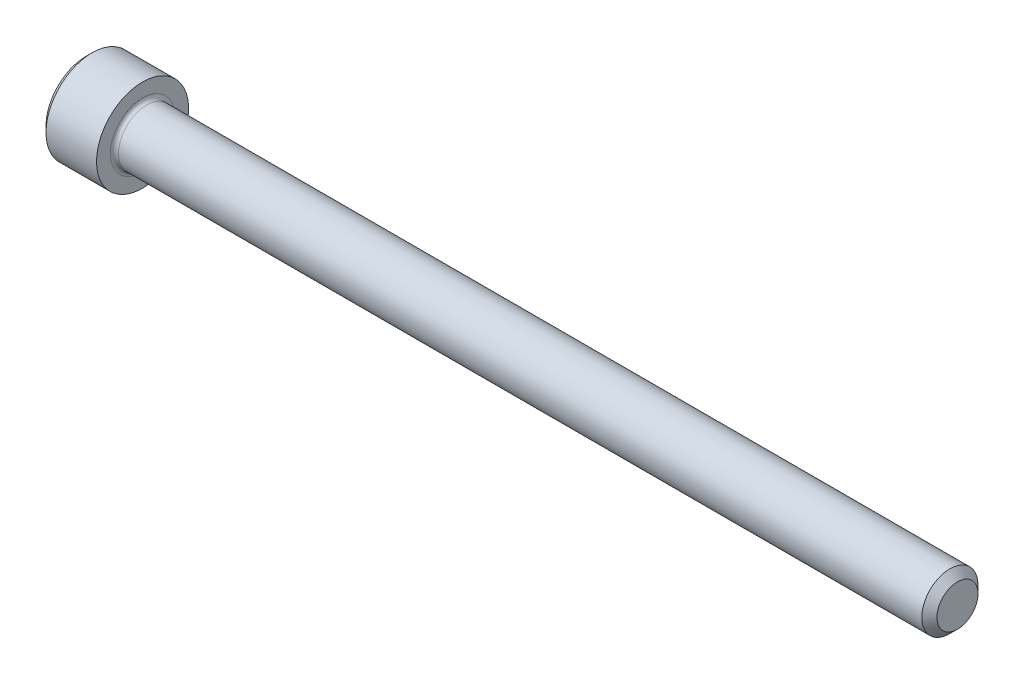
ISO-10303-21;
HEADER;
FILE_DESCRIPTION(('STEP AP214'),'2;1');
FILE_NAME('part.step','',(''),(''),'','','');
FILE_SCHEMA(('AUTOMOTIVE_DESIGN { 1 0 10303 214 1 1 1 1 }'));
ENDSEC;
DATA;
#1=APPLICATION_CONTEXT('core data for automotive mechanical design processes');
#2=APPLICATION_PROTOCOL_DEFINITION('international standard','automotive_design',2000,#1);
#3=PRODUCT_CONTEXT('',#1,'mechanical');
#4=PRODUCT('Part','Part','',(#3));
#5=PRODUCT_RELATED_PRODUCT_CATEGORY('part','',(#4));
#6=PRODUCT_DEFINITION_FORMATION('','',#4);
#7=PRODUCT_DEFINITION_CONTEXT('part definition',#1,'design');
#8=PRODUCT_DEFINITION('design','',#6,#7);
#9=PRODUCT_DEFINITION_SHAPE('','',#8);
#10=(LENGTH_UNIT() NAMED_UNIT(*) SI_UNIT(.MILLI.,.METRE.));
#11=(NAMED_UNIT(*) PLANE_ANGLE_UNIT() SI_UNIT($,.RADIAN.));
#12=(NAMED_UNIT(*) SI_UNIT($,.STERADIAN.) SOLID_ANGLE_UNIT());
#13=UNCERTAINTY_MEASURE_WITH_UNIT(LENGTH_MEASURE(1.E-05),#10,'distance_accuracy_value','');
#14=(GEOMETRIC_REPRESENTATION_CONTEXT(3) GLOBAL_UNCERTAINTY_ASSIGNED_CONTEXT((#13)) GLOBAL_UNIT_ASSIGNED_CONTEXT((#10,
#11,#12)) REPRESENTATION_CONTEXT('',''));
#15=CARTESIAN_POINT('',(0.,0.,0.));
#16=DIRECTION('',(0.,0.,1.));
#17=DIRECTION('',(1.,0.,0.));
#18=AXIS2_PLACEMENT_3D('',#15,#16,#17);
#19=CARTESIAN_POINT('',(1.62560000006806,0.,0.));
#20=DIRECTION('',(-1.,0.,0.));
#21=DIRECTION('',(0.,0.,1.));
#22=AXIS2_PLACEMENT_3D('',#19,#20,#21);
#23=CONICAL_SURFACE('',#22,1.38430000004064,1.04719755119643);
#24=CARTESIAN_POINT('',(2.42482597772664,0.,5.6843418860808E-11));
#25=VERTEX_POINT('',#24);
#26=VERTEX_LOOP('',#25);
#27=FACE_BOUND('',#26,.T.);
#28=CARTESIAN_POINT('',(1.62560000006806,0.,0.));
#29=DIRECTION('',(-1.,0.,0.));
#30=DIRECTION('',(0.,0.,1.));
#31=AXIS2_PLACEMENT_3D('',#28,#29,#30);
#32=CIRCLE('',#31,1.38430000004064);
#33=CARTESIAN_POINT('',(1.62560000003403,0.,1.38430000002032));
#34=VERTEX_POINT('',#33);
#35=CARTESIAN_POINT('',(1.62560000003403,-1.19883896647639,0.69215000001016));
#36=VERTEX_POINT('',#35);
#37=EDGE_CURVE('E99',#34,#36,#32,.F.);
#38=ORIENTED_EDGE('',*,*,#37,.F.);
#39=CARTESIAN_POINT('',(1.62560000006806,0.,0.));
#40=DIRECTION('',(-1.,0.,0.));
#41=DIRECTION('',(0.,0.,1.));
#42=AXIS2_PLACEMENT_3D('',#39,#40,#41);
#43=CIRCLE('',#42,1.38430000004064);
#44=CARTESIAN_POINT('',(1.62560000003403,1.1988389664764,0.692150000010158));
#45=VERTEX_POINT('',#44);
#46=EDGE_CURVE('E96',#45,#34,#43,.F.);
#47=ORIENTED_EDGE('',*,*,#46,.F.);
#48=CARTESIAN_POINT('',(1.62560000006806,0.,0.));
#49=DIRECTION('',(-1.,0.,0.));
#50=DIRECTION('',(0.,0.,1.));
#51=AXIS2_PLACEMENT_3D('',#48,#49,#50);
#52=CIRCLE('',#51,1.38430000004064);
#53=CARTESIAN_POINT('',(1.62560000003403,1.1988389664764,-0.692150000010162));
#54=VERTEX_POINT('',#53);
#55=EDGE_CURVE('E157',#54,#45,#52,.F.);
#56=ORIENTED_EDGE('',*,*,#55,.F.);
#57=CARTESIAN_POINT('',(1.62560000006806,0.,0.));
#58=DIRECTION('',(-1.,0.,0.));
#59=DIRECTION('',(0.,0.,1.));
#60=AXIS2_PLACEMENT_3D('',#57,#58,#59);
#61=CIRCLE('',#60,1.38430000004064);
#62=CARTESIAN_POINT('',(1.62560000003403,0.,-1.38430000002032));
#63=VERTEX_POINT('',#62);
#64=EDGE_CURVE('E154',#63,#54,#61,.F.);
#65=ORIENTED_EDGE('',*,*,#64,.F.);
#66=CARTESIAN_POINT('',(1.62560000006806,0.,0.));
#67=DIRECTION('',(-1.,0.,0.));
#68=DIRECTION('',(0.,0.,1.));
#69=AXIS2_PLACEMENT_3D('',#66,#67,#68);
#70=CIRCLE('',#69,1.38430000004064);
#71=CARTESIAN_POINT('',(1.62560000003403,-1.19883896647639,-0.692150000010157));
#72=VERTEX_POINT('',#71);
#73=EDGE_CURVE('E159',#72,#63,#70,.F.);
#74=ORIENTED_EDGE('',*,*,#73,.F.);
#75=CARTESIAN_POINT('',(1.62560000006806,0.,0.));
#76=DIRECTION('',(-1.,0.,0.));
#77=DIRECTION('',(0.,0.,1.));
#78=AXIS2_PLACEMENT_3D('',#75,#76,#77);
#79=CIRCLE('',#78,1.38430000004064);
#80=EDGE_CURVE('E102',#36,#72,#79,.F.);
#81=ORIENTED_EDGE('',*,*,#80,.F.);
#82=EDGE_LOOP('',(#38,#47,#56,#65,#74,#81));
#83=FACE_BOUND('',#82,.T.);
#84=ADVANCED_FACE('F17',(#27,#83),#23,.F.);
#85=CARTESIAN_POINT('',(1.6256,0.799225977639204,1.3843));
#86=DIRECTION('',(-1.,0.,0.));
#87=DIRECTION('',(0.,0.,1.));
#88=AXIS2_PLACEMENT_3D('',#85,#86,#87);
#89=PLANE('',#88);
#90=DIRECTION('',(0.,-1.,0.));
#91=VECTOR('',#90,1.);
#92=CARTESIAN_POINT('',(1.6256,-0.799225977639192,1.3843));
#93=LINE('',#92,#91);
#94=CARTESIAN_POINT('',(1.6256,0.799225977639205,1.3843));
#95=VERTEX_POINT('',#94);
#96=EDGE_CURVE('E114',#34,#95,#93,.F.);
#97=ORIENTED_EDGE('',*,*,#96,.T.);
#98=DIRECTION('',(0.,0.499999999999999,-0.86602540378444));
#99=VECTOR('',#98,1.);
#100=CARTESIAN_POINT('',(1.6256,1.5984519552784,0.));
#101=LINE('',#100,#99);
#102=EDGE_CURVE('E115',#45,#95,#101,.F.);
#103=ORIENTED_EDGE('',*,*,#102,.F.);
#104=ORIENTED_EDGE('',*,*,#46,.T.);
#105=EDGE_LOOP('',(#97,#103,#104));
#106=FACE_BOUND('',#105,.T.);
#107=ADVANCED_FACE('F119',(#106),#89,.T.);
#108=CARTESIAN_POINT('',(1.6256,0.799225977639204,1.3843));
#109=DIRECTION('',(-1.,0.,0.));
#110=DIRECTION('',(0.,0.,1.));
#111=AXIS2_PLACEMENT_3D('',#108,#109,#110);
#112=PLANE('',#111);
#113=DIRECTION('',(0.,0.500000000000001,0.866025403784438));
#114=VECTOR('',#113,1.);
#115=CARTESIAN_POINT('',(1.6256,-0.799225977639192,1.3843));
#116=LINE('',#115,#114);
#117=CARTESIAN_POINT('',(1.6256,-0.799225977639192,1.3843));
#118=VERTEX_POINT('',#117);
#119=EDGE_CURVE('E110',#118,#36,#116,.F.);
#120=ORIENTED_EDGE('',*,*,#119,.F.);
#121=DIRECTION('',(0.,-1.,0.));
#122=VECTOR('',#121,1.);
#123=CARTESIAN_POINT('',(1.6256,-0.799225977639192,1.3843));
#124=LINE('',#123,#122);
#125=EDGE_CURVE('E107',#118,#34,#124,.F.);
#126=ORIENTED_EDGE('',*,*,#125,.T.);
#127=ORIENTED_EDGE('',*,*,#37,.T.);
#128=EDGE_LOOP('',(#120,#126,#127));
#129=FACE_BOUND('',#128,.T.);
#130=ADVANCED_FACE('F108',(#129),#112,.T.);
#131=CARTESIAN_POINT('',(1.6256,0.799225977639204,1.3843));
#132=DIRECTION('',(-1.,0.,0.));
#133=DIRECTION('',(0.,0.,1.));
#134=AXIS2_PLACEMENT_3D('',#131,#132,#133);
#135=PLANE('',#134);
#136=DIRECTION('',(0.,-0.499999999999999,0.866025403784439));
#137=VECTOR('',#136,1.);
#138=CARTESIAN_POINT('',(1.6256,-1.59845195527839,0.));
#139=LINE('',#138,#137);
#140=CARTESIAN_POINT('',(1.6256,-1.59845195527839,0.));
#141=VERTEX_POINT('',#140);
#142=EDGE_CURVE('E416',#141,#72,#139,.F.);
#143=ORIENTED_EDGE('',*,*,#142,.F.);
#144=DIRECTION('',(0.,0.500000000000001,0.866025403784438));
#145=VECTOR('',#144,1.);
#146=CARTESIAN_POINT('',(1.6256,-0.799225977639192,1.3843));
#147=LINE('',#146,#145);
#148=EDGE_CURVE('E418',#36,#141,#147,.F.);
#149=ORIENTED_EDGE('',*,*,#148,.F.);
#150=ORIENTED_EDGE('',*,*,#80,.T.);
#151=EDGE_LOOP('',(#143,#149,#150));
#152=FACE_BOUND('',#151,.T.);
#153=ADVANCED_FACE('F278',(#152),#135,.T.);
#154=CARTESIAN_POINT('',(1.6256,0.799225977639204,1.3843));
#155=DIRECTION('',(-1.,0.,0.));
#156=DIRECTION('',(0.,0.,1.));
#157=AXIS2_PLACEMENT_3D('',#154,#155,#156);
#158=PLANE('',#157);
#159=DIRECTION('',(0.,1.,0.));
#160=VECTOR('',#159,1.);
#161=CARTESIAN_POINT('',(1.6256,0.799225977639201,-1.3843));
#162=LINE('',#161,#160);
#163=CARTESIAN_POINT('',(1.6256,-0.799225977639196,-1.3843));
#164=VERTEX_POINT('',#163);
#165=EDGE_CURVE('E472',#63,#164,#162,.F.);
#166=ORIENTED_EDGE('',*,*,#165,.T.);
#167=DIRECTION('',(0.,-0.499999999999999,0.866025403784439));
#168=VECTOR('',#167,1.);
#169=CARTESIAN_POINT('',(1.6256,-1.59845195527839,0.));
#170=LINE('',#169,#168);
#171=EDGE_CURVE('E421',#72,#164,#170,.F.);
#172=ORIENTED_EDGE('',*,*,#171,.F.);
#173=ORIENTED_EDGE('',*,*,#73,.T.);
#174=EDGE_LOOP('',(#166,#172,#173));
#175=FACE_BOUND('',#174,.T.);
#176=ADVANCED_FACE('F274',(#175),#158,.T.);
#177=CARTESIAN_POINT('',(1.6256,0.799225977639204,1.3843));
#178=DIRECTION('',(-1.,0.,0.));
#179=DIRECTION('',(0.,0.,1.));
#180=AXIS2_PLACEMENT_3D('',#177,#178,#179);
#181=PLANE('',#180);
#182=DIRECTION('',(0.,0.499999999999999,-0.86602540378444));
#183=VECTOR('',#182,1.);
#184=CARTESIAN_POINT('',(1.6256,1.5984519552784,0.));
#185=LINE('',#184,#183);
#186=CARTESIAN_POINT('',(1.6256,1.5984519552784,0.));
#187=VERTEX_POINT('',#186);
#188=EDGE_CURVE('E137',#187,#45,#185,.F.);
#189=ORIENTED_EDGE('',*,*,#188,.F.);
#190=DIRECTION('',(0.,0.500000000000001,0.866025403784438));
#191=VECTOR('',#190,1.);
#192=CARTESIAN_POINT('',(1.6256,1.5984519552784,0.));
#193=LINE('',#192,#191);
#194=EDGE_CURVE('E487',#187,#54,#193,.F.);
#195=ORIENTED_EDGE('',*,*,#194,.T.);
#196=ORIENTED_EDGE('',*,*,#55,.T.);
#197=EDGE_LOOP('',(#189,#195,#196));
#198=FACE_BOUND('',#197,.T.);
#199=ADVANCED_FACE('F270',(#198),#181,.T.);
#200=CARTESIAN_POINT('',(1.6256,0.799225977639204,1.3843));
#201=DIRECTION('',(-1.,0.,0.));
#202=DIRECTION('',(0.,0.,1.));
#203=AXIS2_PLACEMENT_3D('',#200,#201,#202);
#204=PLANE('',#203);
#205=DIRECTION('',(0.,0.500000000000001,0.866025403784438));
#206=VECTOR('',#205,1.);
#207=CARTESIAN_POINT('',(1.6256,1.5984519552784,0.));
#208=LINE('',#207,#206);
#209=CARTESIAN_POINT('',(1.6256,0.799225977639201,-1.3843));
#210=VERTEX_POINT('',#209);
#211=EDGE_CURVE('E461',#54,#210,#208,.F.);
#212=ORIENTED_EDGE('',*,*,#211,.T.);
#213=DIRECTION('',(0.,1.,0.));
#214=VECTOR('',#213,1.);
#215=CARTESIAN_POINT('',(1.6256,0.799225977639201,-1.3843));
#216=LINE('',#215,#214);
#217=EDGE_CURVE('E475',#210,#63,#216,.F.);
#218=ORIENTED_EDGE('',*,*,#217,.T.);
#219=ORIENTED_EDGE('',*,*,#64,.T.);
#220=EDGE_LOOP('',(#212,#218,#219));
#221=FACE_BOUND('',#220,.T.);
#222=ADVANCED_FACE('F266',(#221),#204,.T.);
#223=CARTESIAN_POINT('',(1.6256,1.5984519552784,0.));
#224=DIRECTION('',(0.,-0.86602540378444,-0.499999999999999));
#225=DIRECTION('',(0.,0.499999999999999,-0.86602540378444));
#226=AXIS2_PLACEMENT_3D('',#223,#224,#225);
#227=PLANE('',#226);
#228=ORIENTED_EDGE('',*,*,#102,.T.);
#229=DIRECTION('',(1.,0.,0.));
#230=VECTOR('',#229,1.);
#231=CARTESIAN_POINT('',(1.6256,0.799225977639205,1.3843));
#232=LINE('',#231,#230);
#233=CARTESIAN_POINT('',(0.,0.799225977639205,1.3843));
#234=VERTEX_POINT('',#233);
#235=EDGE_CURVE('E126',#95,#234,#232,.F.);
#236=ORIENTED_EDGE('',*,*,#235,.T.);
#237=DIRECTION('',(0.,-0.499999999999999,0.866025403784439));
#238=VECTOR('',#237,1.);
#239=CARTESIAN_POINT('',(0.,1.5984519552784,0.));
#240=LINE('',#239,#238);
#241=CARTESIAN_POINT('',(0.,1.5984519552784,0.));
#242=VERTEX_POINT('',#241);
#243=EDGE_CURVE('E455',#242,#234,#240,.T.);
#244=ORIENTED_EDGE('',*,*,#243,.F.);
#245=DIRECTION('',(1.,0.,0.));
#246=VECTOR('',#245,1.);
#247=CARTESIAN_POINT('',(1.6256,1.5984519552784,0.));
#248=LINE('',#247,#246);
#249=EDGE_CURVE('E482',#242,#187,#248,.T.);
#250=ORIENTED_EDGE('',*,*,#249,.T.);
#251=ORIENTED_EDGE('',*,*,#188,.T.);
#252=EDGE_LOOP('',(#228,#236,#244,#250,#251));
#253=FACE_BOUND('',#252,.T.);
#254=ADVANCED_FACE('F263',(#253),#227,.T.);
#255=CARTESIAN_POINT('',(1.6256,-0.799225977639192,1.3843));
#256=DIRECTION('',(0.,0.,1.));
#257=DIRECTION('',(0.,-1.,0.));
#258=AXIS2_PLACEMENT_3D('',#255,#256,#257);
#259=PLANE('',#258);
#260=ORIENTED_EDGE('',*,*,#235,.F.);
#261=ORIENTED_EDGE('',*,*,#96,.F.);
#262=ORIENTED_EDGE('',*,*,#125,.F.);
#263=DIRECTION('',(1.,0.,0.));
#264=VECTOR('',#263,1.);
#265=CARTESIAN_POINT('',(1.6256,-0.799225977639192,1.3843));
#266=LINE('',#265,#264);
#267=CARTESIAN_POINT('',(0.,-0.799225977639192,1.3843));
#268=VERTEX_POINT('',#267);
#269=EDGE_CURVE('E128',#268,#118,#266,.T.);
#270=ORIENTED_EDGE('',*,*,#269,.F.);
#271=DIRECTION('',(0.,1.,0.));
#272=VECTOR('',#271,1.);
#273=CARTESIAN_POINT('',(0.,0.,1.3843));
#274=LINE('',#273,#272);
#275=EDGE_CURVE('E444',#234,#268,#274,.F.);
#276=ORIENTED_EDGE('',*,*,#275,.F.);
#277=EDGE_LOOP('',(#260,#261,#262,#270,#276));
#278=FACE_BOUND('',#277,.T.);
#279=ADVANCED_FACE('F124',(#278),#259,.F.);
#280=CARTESIAN_POINT('',(1.6256,-0.799225977639192,1.3843));
#281=DIRECTION('',(0.,0.866025403784438,-0.500000000000001));
#282=DIRECTION('',(0.,0.500000000000001,0.866025403784438));
#283=AXIS2_PLACEMENT_3D('',#280,#281,#282);
#284=PLANE('',#283);
#285=ORIENTED_EDGE('',*,*,#148,.T.);
#286=DIRECTION('',(1.,0.,0.));
#287=VECTOR('',#286,1.);
#288=CARTESIAN_POINT('',(1.6256,-1.59845195527839,0.));
#289=LINE('',#288,#287);
#290=CARTESIAN_POINT('',(0.,-1.59845195527839,0.));
#291=VERTEX_POINT('',#290);
#292=EDGE_CURVE('E422',#291,#141,#289,.T.);
#293=ORIENTED_EDGE('',*,*,#292,.F.);
#294=DIRECTION('',(0.,-0.500000000000001,-0.866025403784438));
#295=VECTOR('',#294,1.);
#296=CARTESIAN_POINT('',(0.,-0.799225977639192,1.3843));
#297=LINE('',#296,#295);
#298=EDGE_CURVE('E440',#268,#291,#297,.T.);
#299=ORIENTED_EDGE('',*,*,#298,.F.);
#300=ORIENTED_EDGE('',*,*,#269,.T.);
#301=ORIENTED_EDGE('',*,*,#119,.T.);
#302=EDGE_LOOP('',(#285,#293,#299,#300,#301));
#303=FACE_BOUND('',#302,.T.);
#304=ADVANCED_FACE('F256',(#303),#284,.T.);
#305=CARTESIAN_POINT('',(1.6256,-1.59845195527839,0.));
#306=DIRECTION('',(0.,0.866025403784439,0.499999999999999));
#307=DIRECTION('',(0.,-0.499999999999999,0.866025403784439));
#308=AXIS2_PLACEMENT_3D('',#305,#306,#307);
#309=PLANE('',#308);
#310=ORIENTED_EDGE('',*,*,#171,.T.);
#311=DIRECTION('',(1.,0.,0.));
#312=VECTOR('',#311,1.);
#313=CARTESIAN_POINT('',(1.6256,-0.799225977639196,-1.3843));
#314=LINE('',#313,#312);
#315=CARTESIAN_POINT('',(0.,-0.799225977639196,-1.3843));
#316=VERTEX_POINT('',#315);
#317=EDGE_CURVE('E474',#164,#316,#314,.F.);
#318=ORIENTED_EDGE('',*,*,#317,.T.);
#319=DIRECTION('',(0.,0.499999999999999,-0.866025403784439));
#320=VECTOR('',#319,1.);
#321=CARTESIAN_POINT('',(0.,-1.59845195527839,0.));
#322=LINE('',#321,#320);
#323=EDGE_CURVE('E426',#291,#316,#322,.T.);
#324=ORIENTED_EDGE('',*,*,#323,.F.);
#325=ORIENTED_EDGE('',*,*,#292,.T.);
#326=ORIENTED_EDGE('',*,*,#142,.T.);
#327=EDGE_LOOP('',(#310,#318,#324,#325,#326));
#328=FACE_BOUND('',#327,.T.);
#329=ADVANCED_FACE('F252',(#328),#309,.T.);
#330=CARTESIAN_POINT('',(1.6256,0.799225977639201,-1.3843));
#331=DIRECTION('',(0.,0.,-1.));
#332=DIRECTION('',(0.,1.,0.));
#333=AXIS2_PLACEMENT_3D('',#330,#331,#332);
#334=PLANE('',#333);
#335=ORIENTED_EDGE('',*,*,#317,.F.);
#336=ORIENTED_EDGE('',*,*,#165,.F.);
#337=ORIENTED_EDGE('',*,*,#217,.F.);
#338=DIRECTION('',(1.,0.,0.));
#339=VECTOR('',#338,1.);
#340=CARTESIAN_POINT('',(1.6256,0.799225977639201,-1.3843));
#341=LINE('',#340,#339);
#342=CARTESIAN_POINT('',(0.,0.799225977639201,-1.3843));
#343=VERTEX_POINT('',#342);
#344=EDGE_CURVE('E458',#210,#343,#341,.F.);
#345=ORIENTED_EDGE('',*,*,#344,.T.);
#346=DIRECTION('',(0.,1.,0.));
#347=VECTOR('',#346,1.);
#348=CARTESIAN_POINT('',(0.,0.,-1.3843));
#349=LINE('',#348,#347);
#350=EDGE_CURVE('E439',#316,#343,#349,.T.);
#351=ORIENTED_EDGE('',*,*,#350,.F.);
#352=EDGE_LOOP('',(#335,#336,#337,#345,#351));
#353=FACE_BOUND('',#352,.T.);
#354=ADVANCED_FACE('F248',(#353),#334,.F.);
#355=CARTESIAN_POINT('',(1.6256,1.5984519552784,0.));
#356=DIRECTION('',(0.,0.866025403784438,-0.500000000000001));
#357=DIRECTION('',(0.,0.500000000000001,0.866025403784438));
#358=AXIS2_PLACEMENT_3D('',#355,#356,#357);
#359=PLANE('',#358);
#360=ORIENTED_EDGE('',*,*,#344,.F.);
#361=ORIENTED_EDGE('',*,*,#211,.F.);
#362=ORIENTED_EDGE('',*,*,#194,.F.);
#363=ORIENTED_EDGE('',*,*,#249,.F.);
#364=DIRECTION('',(0.,0.500000000000001,0.866025403784438));
#365=VECTOR('',#364,1.);
#366=CARTESIAN_POINT('',(0.,0.799225977639201,-1.3843));
#367=LINE('',#366,#365);
#368=EDGE_CURVE('E153',#343,#242,#367,.T.);
#369=ORIENTED_EDGE('',*,*,#368,.F.);
#370=EDGE_LOOP('',(#360,#361,#362,#363,#369));
#371=FACE_BOUND('',#370,.T.);
#372=ADVANCED_FACE('F244',(#371),#359,.F.);
#373=CARTESIAN_POINT('',(0.,0.,0.));
#374=DIRECTION('',(-1.,0.,0.));
#375=DIRECTION('',(0.,0.,1.));
#376=AXIS2_PLACEMENT_3D('',#373,#374,#375);
#377=PLANE('',#376);
#378=CARTESIAN_POINT('',(0.,0.,0.));
#379=DIRECTION('',(1.,0.,0.));
#380=DIRECTION('',(0.,0.,-1.));
#381=AXIS2_PLACEMENT_3D('',#378,#379,#380);
#382=CIRCLE('',#381,2.5145999999836);
#383=CARTESIAN_POINT('',(0.,0.,-2.5145999999836));
#384=VERTEX_POINT('',#383);
#385=EDGE_CURVE('E150',#384,#384,#382,.T.);
#386=ORIENTED_EDGE('',*,*,#385,.F.);
#387=EDGE_LOOP('',(#386));
#388=FACE_BOUND('',#387,.T.);
#389=ORIENTED_EDGE('',*,*,#350,.T.);
#390=ORIENTED_EDGE('',*,*,#368,.T.);
#391=ORIENTED_EDGE('',*,*,#243,.T.);
#392=ORIENTED_EDGE('',*,*,#275,.T.);
#393=ORIENTED_EDGE('',*,*,#298,.T.);
#394=ORIENTED_EDGE('',*,*,#323,.T.);
#395=EDGE_LOOP('',(#389,#390,#391,#392,#393,#394));
#396=FACE_BOUND('',#395,.T.);
#397=ADVANCED_FACE('F236',(#388,#396),#377,.T.);
#398=CARTESIAN_POINT('',(0.355599999863898,0.,0.));
#399=DIRECTION('',(1.,0.,0.));
#400=DIRECTION('',(0.,0.,-1.));
#401=AXIS2_PLACEMENT_3D('',#398,#399,#400);
#402=CONICAL_SURFACE('',#401,2.87019999990434,0.785398163477374);
#403=ORIENTED_EDGE('',*,*,#385,.T.);
#404=EDGE_LOOP('',(#403));
#405=FACE_BOUND('',#404,.T.);
#406=CARTESIAN_POINT('',(0.355599999999998,0.,0.));
#407=DIRECTION('',(-1.,0.,0.));
#408=DIRECTION('',(0.,0.,1.));
#409=AXIS2_PLACEMENT_3D('',#406,#407,#408);
#410=CIRCLE('',#409,2.8702);
#411=CARTESIAN_POINT('',(0.355599999999998,0.,2.8702));
#412=VERTEX_POINT('',#411);
#413=EDGE_CURVE('E149',#412,#412,#410,.F.);
#414=ORIENTED_EDGE('',*,*,#413,.F.);
#415=EDGE_LOOP('',(#414));
#416=FACE_BOUND('',#415,.T.);
#417=ADVANCED_FACE('F231',(#405,#416),#402,.T.);
#418=CARTESIAN_POINT('',(-31.75,0.,0.));
#419=DIRECTION('',(-1.,0.,0.));
#420=DIRECTION('',(0.,0.,1.));
#421=AXIS2_PLACEMENT_3D('',#418,#419,#420);
#422=CYLINDRICAL_SURFACE('',#421,2.8702);
#423=CARTESIAN_POINT('',(3.5052,0.,0.));
#424=DIRECTION('',(-1.,0.,0.));
#425=DIRECTION('',(0.,0.,1.));
#426=AXIS2_PLACEMENT_3D('',#423,#424,#425);
#427=CIRCLE('',#426,2.8702);
#428=CARTESIAN_POINT('',(3.5052,0.,2.8702));
#429=VERTEX_POINT('',#428);
#430=EDGE_CURVE('E146',#429,#429,#427,.F.);
#431=ORIENTED_EDGE('',*,*,#430,.F.);
#432=EDGE_LOOP('',(#431));
#433=FACE_BOUND('',#432,.T.);
#434=ORIENTED_EDGE('',*,*,#413,.T.);
#435=EDGE_LOOP('',(#434));
#436=FACE_BOUND('',#435,.T.);
#437=ADVANCED_FACE('F227',(#433,#436),#422,.T.);
#438=CARTESIAN_POINT('',(54.3052,1.28016,0.));
#439=DIRECTION('',(1.,0.,0.));
#440=DIRECTION('',(0.,0.,-1.));
#441=AXIS2_PLACEMENT_3D('',#438,#439,#440);
#442=PLANE('',#441);
#443=CARTESIAN_POINT('',(54.3052000000444,0.,0.));
#444=DIRECTION('',(-1.,0.,0.));
#445=DIRECTION('',(0.,0.,1.));
#446=AXIS2_PLACEMENT_3D('',#443,#444,#445);
#447=CIRCLE('',#446,1.28016000002162);
#448=CARTESIAN_POINT('',(54.3052000000444,0.,1.28016000002162));
#449=VERTEX_POINT('',#448);
#450=EDGE_CURVE('E142',#449,#449,#447,.T.);
#451=ORIENTED_EDGE('',*,*,#450,.F.);
#452=EDGE_LOOP('',(#451));
#453=FACE_BOUND('',#452,.T.);
#454=ADVANCED_FACE('F185',(#453),#442,.T.);
#455=CARTESIAN_POINT('',(3.5052,2.8702,0.));
#456=DIRECTION('',(1.,0.,0.));
#457=DIRECTION('',(0.,0.,-1.));
#458=AXIS2_PLACEMENT_3D('',#455,#456,#457);
#459=PLANE('',#458);
#460=ORIENTED_EDGE('',*,*,#430,.T.);
#461=EDGE_LOOP('',(#460));
#462=FACE_BOUND('',#461,.T.);
#463=CARTESIAN_POINT('',(3.5052,0.,0.));
#464=DIRECTION('',(1.,0.,0.));
#465=DIRECTION('',(0.,0.,1.));
#466=AXIS2_PLACEMENT_3D('',#463,#464,#465);
#467=CIRCLE('',#466,2.00659999999994);
#468=CARTESIAN_POINT('',(3.5052,0.,-2.00659999999994));
#469=VERTEX_POINT('',#468);
#470=CARTESIAN_POINT('',(3.5052,0.,2.00659999999994));
#471=VERTEX_POINT('',#470);
#472=EDGE_CURVE('E145',#469,#471,#467,.F.);
#473=ORIENTED_EDGE('',*,*,#472,.T.);
#474=CARTESIAN_POINT('',(3.5052,0.,0.));
#475=DIRECTION('',(1.,0.,0.));
#476=DIRECTION('',(0.,0.,-1.));
#477=AXIS2_PLACEMENT_3D('',#474,#475,#476);
#478=CIRCLE('',#477,2.00659999999994);
#479=EDGE_CURVE('E36',#471,#469,#478,.F.);
#480=ORIENTED_EDGE('',*,*,#479,.T.);
#481=EDGE_LOOP('',(#473,#480));
#482=FACE_BOUND('',#481,.T.);
#483=ADVANCED_FACE('F166',(#462,#482),#459,.T.);
#484=CARTESIAN_POINT('',(53.832760000148,0.,0.));
#485=DIRECTION('',(-1.,0.,0.));
#486=DIRECTION('',(0.,0.,1.));
#487=AXIS2_PLACEMENT_3D('',#484,#485,#486);
#488=CONICAL_SURFACE('',#487,1.75259999991795,0.785398163397448);
#489=CARTESIAN_POINT('',(53.8327599999999,0.,0.));
#490=DIRECTION('',(-1.,0.,0.));
#491=DIRECTION('',(0.,0.,1.));
#492=AXIS2_PLACEMENT_3D('',#489,#490,#491);
#493=CIRCLE('',#492,1.75259999999994);
#494=CARTESIAN_POINT('',(53.8327599999999,0.,1.75259999999994));
#495=VERTEX_POINT('',#494);
#496=EDGE_CURVE('E28',#495,#495,#493,.T.);
#497=ORIENTED_EDGE('',*,*,#496,.F.);
#498=EDGE_LOOP('',(#497));
#499=FACE_BOUND('',#498,.T.);
#500=ORIENTED_EDGE('',*,*,#450,.T.);
#501=EDGE_LOOP('',(#500));
#502=FACE_BOUND('',#501,.T.);
#503=ADVANCED_FACE('F184',(#499,#502),#488,.T.);
#504=CARTESIAN_POINT('',(3.7592,0.,0.));
#505=DIRECTION('',(1.,0.,0.));
#506=DIRECTION('',(0.,0.,-1.));
#507=AXIS2_PLACEMENT_3D('',#504,#505,#506);
#508=TOROIDAL_SURFACE('',#507,2.00659999999994,0.254);
#509=CARTESIAN_POINT('',(3.7592,0.,0.));
#510=DIRECTION('',(-1.,0.,0.));
#511=DIRECTION('',(0.,0.,1.));
#512=AXIS2_PLACEMENT_3D('',#509,#510,#511);
#513=CIRCLE('',#512,1.75259999999994);
#514=CARTESIAN_POINT('',(3.7592,0.,1.75259999999994));
#515=VERTEX_POINT('',#514);
#516=EDGE_CURVE('E11',#515,#515,#513,.F.);
#517=ORIENTED_EDGE('',*,*,#516,.F.);
#518=EDGE_LOOP('',(#517));
#519=FACE_BOUND('',#518,.T.);
#520=ORIENTED_EDGE('',*,*,#472,.F.);
#521=ORIENTED_EDGE('',*,*,#479,.F.);
#522=EDGE_LOOP('',(#520,#521));
#523=FACE_BOUND('',#522,.T.);
#524=ADVANCED_FACE('F163',(#519,#523),#508,.F.);
#525=CARTESIAN_POINT('',(-31.75,0.,0.));
#526=DIRECTION('',(-1.,0.,0.));
#527=DIRECTION('',(0.,0.,1.));
#528=AXIS2_PLACEMENT_3D('',#525,#526,#527);
#529=CYLINDRICAL_SURFACE('',#528,1.75259999999994);
#530=ORIENTED_EDGE('',*,*,#516,.T.);
#531=EDGE_LOOP('',(#530));
#532=FACE_BOUND('',#531,.T.);
#533=ORIENTED_EDGE('',*,*,#496,.T.);
#534=EDGE_LOOP('',(#533));
#535=FACE_BOUND('',#534,.T.);
#536=ADVANCED_FACE('F209',(#532,#535),#529,.T.);
#537=CLOSED_SHELL('',(#84,#107,#130,#153,#176,#199,#222,#254,#279,#304,#329,#354,#372,#397,#417,
#437,#454,#483,#503,#524,#536));
#538=MANIFOLD_SOLID_BREP('B1',#537);
#539=ADVANCED_BREP_SHAPE_REPRESENTATION('',(#18,#538),#14);
#540=SHAPE_DEFINITION_REPRESENTATION(#9,#539);
ENDSEC;
END-ISO-10303-21;
